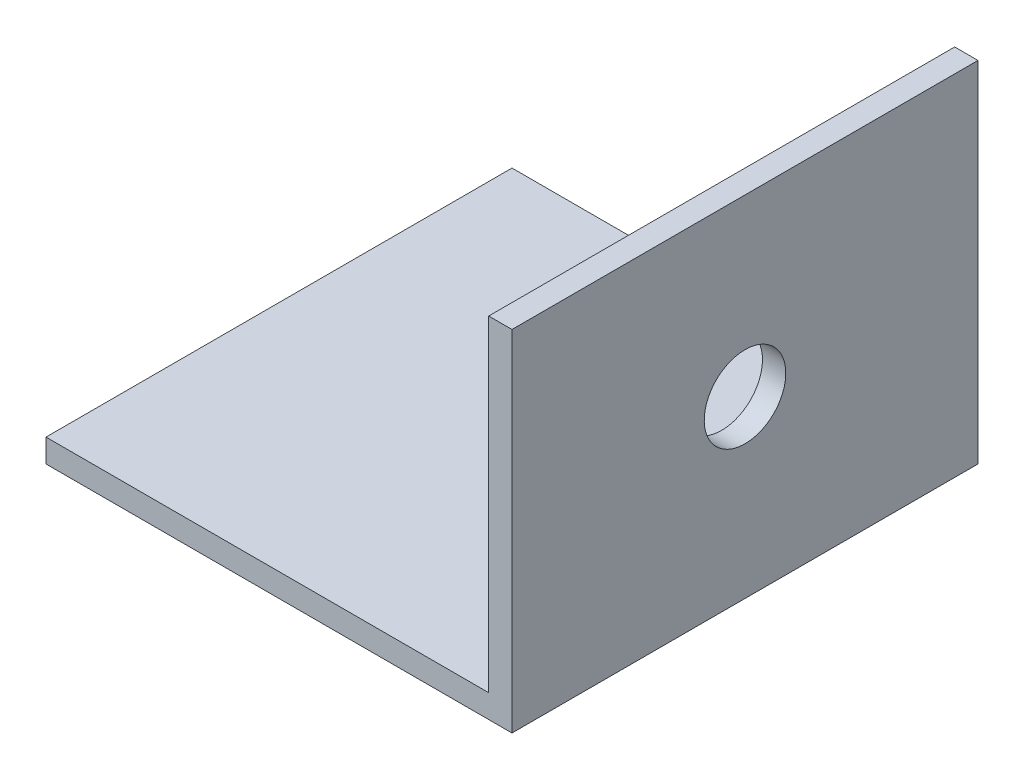
ISO-10303-21;
HEADER;
FILE_DESCRIPTION(('STEP AP214'),'2;1');
FILE_NAME('part.step','',(''),(''),'','','');
FILE_SCHEMA(('AUTOMOTIVE_DESIGN { 1 0 10303 214 1 1 1 1 }'));
ENDSEC;
DATA;
#1=APPLICATION_CONTEXT('core data for automotive mechanical design processes');
#2=APPLICATION_PROTOCOL_DEFINITION('international standard','automotive_design',2000,#1);
#3=PRODUCT_CONTEXT('',#1,'mechanical');
#4=PRODUCT('Part','Part','',(#3));
#5=PRODUCT_RELATED_PRODUCT_CATEGORY('part','',(#4));
#6=PRODUCT_DEFINITION_FORMATION('','',#4);
#7=PRODUCT_DEFINITION_CONTEXT('part definition',#1,'design');
#8=PRODUCT_DEFINITION('design','',#6,#7);
#9=PRODUCT_DEFINITION_SHAPE('','',#8);
#10=(LENGTH_UNIT() NAMED_UNIT(*) SI_UNIT(.MILLI.,.METRE.));
#11=(NAMED_UNIT(*) PLANE_ANGLE_UNIT() SI_UNIT($,.RADIAN.));
#12=(NAMED_UNIT(*) SI_UNIT($,.STERADIAN.) SOLID_ANGLE_UNIT());
#13=UNCERTAINTY_MEASURE_WITH_UNIT(LENGTH_MEASURE(1.E-05),#10,'distance_accuracy_value','');
#14=(GEOMETRIC_REPRESENTATION_CONTEXT(3) GLOBAL_UNCERTAINTY_ASSIGNED_CONTEXT((#13)) GLOBAL_UNIT_ASSIGNED_CONTEXT((#10,
#11,#12)) REPRESENTATION_CONTEXT('',''));
#15=CARTESIAN_POINT('',(0.,0.,0.));
#16=DIRECTION('',(0.,0.,1.));
#17=DIRECTION('',(1.,0.,0.));
#18=AXIS2_PLACEMENT_3D('',#15,#16,#17);
#19=CARTESIAN_POINT('',(0.551367025683506,28.1830985915493,40.));
#20=DIRECTION('',(0.,-1.,0.));
#21=DIRECTION('',(0.,0.,-1.));
#22=AXIS2_PLACEMENT_3D('',#19,#20,#21);
#23=PLANE('',#22);
#24=DIRECTION('',(-1.,0.,0.));
#25=VECTOR('',#24,1.);
#26=CARTESIAN_POINT('',(0.551367025683506,28.1830985915493,0.));
#27=LINE('',#26,#25);
#28=CARTESIAN_POINT('',(0.551367025683506,28.1830985915493,0.));
#29=VERTEX_POINT('',#28);
#30=CARTESIAN_POINT('',(-1.44863297431649,28.1830985915493,0.));
#31=VERTEX_POINT('',#30);
#32=EDGE_CURVE('E127',#29,#31,#27,.T.);
#33=ORIENTED_EDGE('',*,*,#32,.T.);
#34=DIRECTION('',(0.,0.,-1.));
#35=VECTOR('',#34,1.);
#36=CARTESIAN_POINT('',(-1.44863297431649,28.1830985915493,40.));
#37=LINE('',#36,#35);
#38=CARTESIAN_POINT('',(-1.44863297431649,28.1830985915493,40.));
#39=VERTEX_POINT('',#38);
#40=EDGE_CURVE('E11',#39,#31,#37,.T.);
#41=ORIENTED_EDGE('',*,*,#40,.F.);
#42=DIRECTION('',(-1.,0.,0.));
#43=VECTOR('',#42,1.);
#44=CARTESIAN_POINT('',(0.551367025683506,28.1830985915493,40.));
#45=LINE('',#44,#43);
#46=CARTESIAN_POINT('',(0.551367025683506,28.1830985915493,40.));
#47=VERTEX_POINT('',#46);
#48=EDGE_CURVE('E138',#47,#39,#45,.T.);
#49=ORIENTED_EDGE('',*,*,#48,.F.);
#50=DIRECTION('',(0.,0.,-1.));
#51=VECTOR('',#50,1.);
#52=CARTESIAN_POINT('',(0.551367025683506,28.1830985915493,40.));
#53=LINE('',#52,#51);
#54=EDGE_CURVE('E123',#47,#29,#53,.T.);
#55=ORIENTED_EDGE('',*,*,#54,.T.);
#56=EDGE_LOOP('',(#33,#41,#49,#55));
#57=FACE_BOUND('',#56,.T.);
#58=ADVANCED_FACE('F43',(#57),#23,.F.);
#59=CARTESIAN_POINT('',(-1.44863297431649,28.1830985915493,40.));
#60=DIRECTION('',(1.,0.,0.));
#61=DIRECTION('',(0.,1.,0.));
#62=AXIS2_PLACEMENT_3D('',#59,#60,#61);
#63=PLANE('',#62);
#64=CARTESIAN_POINT('',(-1.44863297431649,13.1830985915493,20.));
#65=DIRECTION('',(1.,0.,0.));
#66=DIRECTION('',(0.,1.,0.));
#67=AXIS2_PLACEMENT_3D('',#64,#65,#66);
#68=CIRCLE('',#67,3.5);
#69=CARTESIAN_POINT('',(-1.44863297431649,16.6830985915493,20.));
#70=VERTEX_POINT('',#69);
#71=EDGE_CURVE('E131',#70,#70,#68,.T.);
#72=ORIENTED_EDGE('',*,*,#71,.T.);
#73=EDGE_LOOP('',(#72));
#74=FACE_BOUND('',#73,.T.);
#75=DIRECTION('',(0.,-1.,0.));
#76=VECTOR('',#75,1.);
#77=CARTESIAN_POINT('',(-1.44863297431649,28.1830985915493,0.));
#78=LINE('',#77,#76);
#79=CARTESIAN_POINT('',(-1.44863297431649,0.183098591549296,0.));
#80=VERTEX_POINT('',#79);
#81=EDGE_CURVE('E130',#31,#80,#78,.T.);
#82=ORIENTED_EDGE('',*,*,#81,.T.);
#83=DIRECTION('',(0.,0.,-1.));
#84=VECTOR('',#83,1.);
#85=CARTESIAN_POINT('',(-1.44863297431649,0.183098591549296,40.));
#86=LINE('',#85,#84);
#87=CARTESIAN_POINT('',(-1.44863297431649,0.183098591549296,40.));
#88=VERTEX_POINT('',#87);
#89=EDGE_CURVE('E51',#88,#80,#86,.T.);
#90=ORIENTED_EDGE('',*,*,#89,.F.);
#91=DIRECTION('',(0.,-1.,0.));
#92=VECTOR('',#91,1.);
#93=CARTESIAN_POINT('',(-1.44863297431649,28.1830985915493,40.));
#94=LINE('',#93,#92);
#95=EDGE_CURVE('E96',#39,#88,#94,.T.);
#96=ORIENTED_EDGE('',*,*,#95,.F.);
#97=ORIENTED_EDGE('',*,*,#40,.T.);
#98=EDGE_LOOP('',(#82,#90,#96,#97));
#99=FACE_BOUND('',#98,.T.);
#100=ADVANCED_FACE('F166',(#74,#99),#63,.F.);
#101=CARTESIAN_POINT('',(-1.44863297431649,0.183098591549296,40.));
#102=DIRECTION('',(0.,-1.,0.));
#103=DIRECTION('',(1.,0.,0.));
#104=AXIS2_PLACEMENT_3D('',#101,#102,#103);
#105=PLANE('',#104);
#106=DIRECTION('',(-1.,0.,0.));
#107=VECTOR('',#106,1.);
#108=CARTESIAN_POINT('',(-1.44863297431649,0.183098591549296,0.));
#109=LINE('',#108,#107);
#110=CARTESIAN_POINT('',(-39.4486329743165,0.183098591549294,0.));
#111=VERTEX_POINT('',#110);
#112=EDGE_CURVE('E133',#80,#111,#109,.T.);
#113=ORIENTED_EDGE('',*,*,#112,.T.);
#114=DIRECTION('',(0.,0.,-1.));
#115=VECTOR('',#114,1.);
#116=CARTESIAN_POINT('',(-39.4486329743165,0.183098591549294,40.));
#117=LINE('',#116,#115);
#118=CARTESIAN_POINT('',(-39.4486329743165,0.183098591549294,40.));
#119=VERTEX_POINT('',#118);
#120=EDGE_CURVE('E118',#119,#111,#117,.T.);
#121=ORIENTED_EDGE('',*,*,#120,.F.);
#122=DIRECTION('',(-1.,0.,0.));
#123=VECTOR('',#122,1.);
#124=CARTESIAN_POINT('',(-1.44863297431649,0.183098591549296,40.));
#125=LINE('',#124,#123);
#126=EDGE_CURVE('E109',#88,#119,#125,.T.);
#127=ORIENTED_EDGE('',*,*,#126,.F.);
#128=ORIENTED_EDGE('',*,*,#89,.T.);
#129=EDGE_LOOP('',(#113,#121,#127,#128));
#130=FACE_BOUND('',#129,.T.);
#131=ADVANCED_FACE('F144',(#130),#105,.F.);
#132=CARTESIAN_POINT('',(-39.4486329743165,0.183098591549294,40.));
#133=DIRECTION('',(1.,0.,0.));
#134=DIRECTION('',(0.,0.,-1.));
#135=AXIS2_PLACEMENT_3D('',#132,#133,#134);
#136=PLANE('',#135);
#137=DIRECTION('',(0.,-1.,0.));
#138=VECTOR('',#137,1.);
#139=CARTESIAN_POINT('',(-39.4486329743165,0.183098591549294,0.));
#140=LINE('',#139,#138);
#141=CARTESIAN_POINT('',(-39.4486329743165,-1.81690140845071,0.));
#142=VERTEX_POINT('',#141);
#143=EDGE_CURVE('E117',#111,#142,#140,.T.);
#144=ORIENTED_EDGE('',*,*,#143,.T.);
#145=DIRECTION('',(0.,0.,-1.));
#146=VECTOR('',#145,1.);
#147=CARTESIAN_POINT('',(-39.4486329743165,-1.81690140845071,40.));
#148=LINE('',#147,#146);
#149=CARTESIAN_POINT('',(-39.4486329743165,-1.81690140845071,40.));
#150=VERTEX_POINT('',#149);
#151=EDGE_CURVE('E114',#150,#142,#148,.T.);
#152=ORIENTED_EDGE('',*,*,#151,.F.);
#153=DIRECTION('',(0.,-1.,0.));
#154=VECTOR('',#153,1.);
#155=CARTESIAN_POINT('',(-39.4486329743165,0.183098591549294,40.));
#156=LINE('',#155,#154);
#157=EDGE_CURVE('E103',#119,#150,#156,.T.);
#158=ORIENTED_EDGE('',*,*,#157,.F.);
#159=ORIENTED_EDGE('',*,*,#120,.T.);
#160=EDGE_LOOP('',(#144,#152,#158,#159));
#161=FACE_BOUND('',#160,.T.);
#162=ADVANCED_FACE('F115',(#161),#136,.F.);
#163=CARTESIAN_POINT('',(-39.4486329743165,-1.81690140845071,40.));
#164=DIRECTION('',(0.,1.,0.));
#165=DIRECTION('',(-1.,0.,0.));
#166=AXIS2_PLACEMENT_3D('',#163,#164,#165);
#167=PLANE('',#166);
#168=DIRECTION('',(1.,0.,0.));
#169=VECTOR('',#168,1.);
#170=CARTESIAN_POINT('',(-39.4486329743165,-1.81690140845071,0.));
#171=LINE('',#170,#169);
#172=CARTESIAN_POINT('',(0.55136702568351,-1.81690140845071,0.));
#173=VERTEX_POINT('',#172);
#174=EDGE_CURVE('E82',#142,#173,#171,.T.);
#175=ORIENTED_EDGE('',*,*,#174,.T.);
#176=DIRECTION('',(0.,0.,-1.));
#177=VECTOR('',#176,1.);
#178=CARTESIAN_POINT('',(0.55136702568351,-1.81690140845071,40.));
#179=LINE('',#178,#177);
#180=CARTESIAN_POINT('',(0.55136702568351,-1.81690140845071,40.));
#181=VERTEX_POINT('',#180);
#182=EDGE_CURVE('E119',#181,#173,#179,.T.);
#183=ORIENTED_EDGE('',*,*,#182,.F.);
#184=DIRECTION('',(1.,0.,0.));
#185=VECTOR('',#184,1.);
#186=CARTESIAN_POINT('',(-39.4486329743165,-1.81690140845071,40.));
#187=LINE('',#186,#185);
#188=EDGE_CURVE('E107',#150,#181,#187,.T.);
#189=ORIENTED_EDGE('',*,*,#188,.F.);
#190=ORIENTED_EDGE('',*,*,#151,.T.);
#191=EDGE_LOOP('',(#175,#183,#189,#190));
#192=FACE_BOUND('',#191,.T.);
#193=ADVANCED_FACE('F121',(#192),#167,.F.);
#194=CARTESIAN_POINT('',(0.551367025683506,28.1830985915493,40.));
#195=DIRECTION('',(-1.,0.,0.));
#196=DIRECTION('',(0.,-1.,0.));
#197=AXIS2_PLACEMENT_3D('',#194,#195,#196);
#198=PLANE('',#197);
#199=CARTESIAN_POINT('',(0.551367025683509,13.1830985915493,20.));
#200=DIRECTION('',(1.,0.,0.));
#201=DIRECTION('',(0.,1.,0.));
#202=AXIS2_PLACEMENT_3D('',#199,#200,#201);
#203=CIRCLE('',#202,3.5);
#204=CARTESIAN_POINT('',(0.551367025683509,16.6830985915493,20.));
#205=VERTEX_POINT('',#204);
#206=EDGE_CURVE('E212',#205,#205,#203,.T.);
#207=ORIENTED_EDGE('',*,*,#206,.F.);
#208=EDGE_LOOP('',(#207));
#209=FACE_BOUND('',#208,.T.);
#210=DIRECTION('',(0.,1.,0.));
#211=VECTOR('',#210,1.);
#212=CARTESIAN_POINT('',(0.551367025683506,28.1830985915493,0.));
#213=LINE('',#212,#211);
#214=EDGE_CURVE('E88',#173,#29,#213,.T.);
#215=ORIENTED_EDGE('',*,*,#214,.T.);
#216=ORIENTED_EDGE('',*,*,#54,.F.);
#217=DIRECTION('',(0.,1.,0.));
#218=VECTOR('',#217,1.);
#219=CARTESIAN_POINT('',(0.551367025683506,28.1830985915493,40.));
#220=LINE('',#219,#218);
#221=EDGE_CURVE('E59',#181,#47,#220,.T.);
#222=ORIENTED_EDGE('',*,*,#221,.F.);
#223=ORIENTED_EDGE('',*,*,#182,.T.);
#224=EDGE_LOOP('',(#215,#216,#222,#223));
#225=FACE_BOUND('',#224,.T.);
#226=ADVANCED_FACE('F151',(#209,#225),#198,.F.);
#227=CARTESIAN_POINT('',(0.,0.,40.));
#228=DIRECTION('',(0.,0.,1.));
#229=DIRECTION('',(1.,0.,0.));
#230=AXIS2_PLACEMENT_3D('',#227,#228,#229);
#231=PLANE('',#230);
#232=ORIENTED_EDGE('',*,*,#48,.T.);
#233=ORIENTED_EDGE('',*,*,#95,.T.);
#234=ORIENTED_EDGE('',*,*,#126,.T.);
#235=ORIENTED_EDGE('',*,*,#157,.T.);
#236=ORIENTED_EDGE('',*,*,#188,.T.);
#237=ORIENTED_EDGE('',*,*,#221,.T.);
#238=EDGE_LOOP('',(#232,#233,#234,#235,#236,#237));
#239=FACE_BOUND('',#238,.T.);
#240=ADVANCED_FACE('F105',(#239),#231,.T.);
#241=CARTESIAN_POINT('',(0.,0.,0.));
#242=DIRECTION('',(0.,0.,1.));
#243=DIRECTION('',(1.,0.,0.));
#244=AXIS2_PLACEMENT_3D('',#241,#242,#243);
#245=PLANE('',#244);
#246=ORIENTED_EDGE('',*,*,#32,.F.);
#247=ORIENTED_EDGE('',*,*,#214,.F.);
#248=ORIENTED_EDGE('',*,*,#174,.F.);
#249=ORIENTED_EDGE('',*,*,#143,.F.);
#250=ORIENTED_EDGE('',*,*,#112,.F.);
#251=ORIENTED_EDGE('',*,*,#81,.F.);
#252=EDGE_LOOP('',(#246,#247,#248,#249,#250,#251));
#253=FACE_BOUND('',#252,.T.);
#254=ADVANCED_FACE('F147',(#253),#245,.F.);
#255=CARTESIAN_POINT('',(-39.4486329743165,13.1830985915493,20.));
#256=DIRECTION('',(1.,0.,0.));
#257=DIRECTION('',(0.,1.,0.));
#258=AXIS2_PLACEMENT_3D('',#255,#256,#257);
#259=CYLINDRICAL_SURFACE('',#258,3.5);
#260=ORIENTED_EDGE('',*,*,#206,.T.);
#261=EDGE_LOOP('',(#260));
#262=FACE_BOUND('',#261,.T.);
#263=ORIENTED_EDGE('',*,*,#71,.F.);
#264=EDGE_LOOP('',(#263));
#265=FACE_BOUND('',#264,.T.);
#266=ADVANCED_FACE('F197',(#262,#265),#259,.F.);
#267=CLOSED_SHELL('',(#58,#100,#131,#162,#193,#226,#240,#254,#266));
#268=MANIFOLD_SOLID_BREP('B2',#267);
#269=ADVANCED_BREP_SHAPE_REPRESENTATION('',(#18,#268),#14);
#270=SHAPE_DEFINITION_REPRESENTATION(#9,#269);
ENDSEC;
END-ISO-10303-21;
